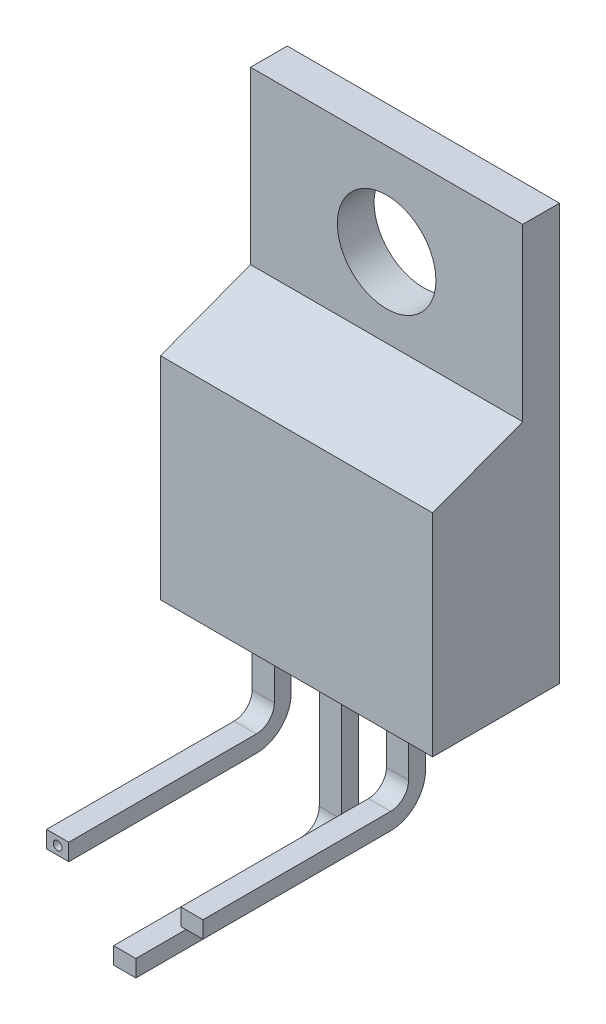
ISO-10303-21;
HEADER;
FILE_DESCRIPTION(('STEP AP214'),'2;1');
FILE_NAME('part.step','',(''),(''),'','','');
FILE_SCHEMA(('AUTOMOTIVE_DESIGN { 1 0 10303 214 1 1 1 1 }'));
ENDSEC;
DATA;
#1=APPLICATION_CONTEXT('core data for automotive mechanical design processes');
#2=APPLICATION_PROTOCOL_DEFINITION('international standard','automotive_design',2000,#1);
#3=PRODUCT_CONTEXT('',#1,'mechanical');
#4=PRODUCT('Part','Part','',(#3));
#5=PRODUCT_RELATED_PRODUCT_CATEGORY('part','',(#4));
#6=PRODUCT_DEFINITION_FORMATION('','',#4);
#7=PRODUCT_DEFINITION_CONTEXT('part definition',#1,'design');
#8=PRODUCT_DEFINITION('design','',#6,#7);
#9=PRODUCT_DEFINITION_SHAPE('','',#8);
#10=(LENGTH_UNIT() NAMED_UNIT(*) SI_UNIT(.MILLI.,.METRE.));
#11=(NAMED_UNIT(*) PLANE_ANGLE_UNIT() SI_UNIT($,.RADIAN.));
#12=(NAMED_UNIT(*) SI_UNIT($,.STERADIAN.) SOLID_ANGLE_UNIT());
#13=UNCERTAINTY_MEASURE_WITH_UNIT(LENGTH_MEASURE(1.E-05),#10,'distance_accuracy_value','');
#14=(GEOMETRIC_REPRESENTATION_CONTEXT(3) GLOBAL_UNCERTAINTY_ASSIGNED_CONTEXT((#13)) GLOBAL_UNIT_ASSIGNED_CONTEXT((#10,
#11,#12)) REPRESENTATION_CONTEXT('',''));
#15=CARTESIAN_POINT('',(0.,0.,0.));
#16=DIRECTION('',(0.,0.,1.));
#17=DIRECTION('',(1.,0.,0.));
#18=AXIS2_PLACEMENT_3D('',#15,#16,#17);
#19=CARTESIAN_POINT('',(-2.61,19.25,0.));
#20=DIRECTION('',(1.,0.,0.));
#21=DIRECTION('',(0.,0.,-1.));
#22=AXIS2_PLACEMENT_3D('',#19,#20,#21);
#23=PLANE('',#22);
#24=DIRECTION('',(0.,-0.351424300429918,0.936216300364047));
#25=VECTOR('',#24,1.);
#26=CARTESIAN_POINT('',(-2.61,12.78,-3.40999999999988));
#27=LINE('',#26,#25);
#28=CARTESIAN_POINT('',(-2.61,12.78,-3.40999999999988));
#29=VERTEX_POINT('',#28);
#30=CARTESIAN_POINT('',(-2.61,11.5,0.));
#31=VERTEX_POINT('',#30);
#32=EDGE_CURVE('E446',#29,#31,#27,.T.);
#33=ORIENTED_EDGE('',*,*,#32,.F.);
#34=DIRECTION('',(0.,-1.,0.));
#35=VECTOR('',#34,1.);
#36=CARTESIAN_POINT('',(-2.61,19.25,-3.40999999999988));
#37=LINE('',#36,#35);
#38=CARTESIAN_POINT('',(-2.61,19.25,-3.40999999999988));
#39=VERTEX_POINT('',#38);
#40=EDGE_CURVE('E444',#39,#29,#37,.T.);
#41=ORIENTED_EDGE('',*,*,#40,.F.);
#42=DIRECTION('',(0.,0.,1.));
#43=VECTOR('',#42,1.);
#44=CARTESIAN_POINT('',(-2.61,19.25,0.));
#45=LINE('',#44,#43);
#46=CARTESIAN_POINT('',(-2.61,19.25,-4.8));
#47=VERTEX_POINT('',#46);
#48=EDGE_CURVE('E455',#47,#39,#45,.T.);
#49=ORIENTED_EDGE('',*,*,#48,.F.);
#50=DIRECTION('',(0.,-1.,0.));
#51=VECTOR('',#50,1.);
#52=CARTESIAN_POINT('',(-2.61,19.25,-4.8));
#53=LINE('',#52,#51);
#54=CARTESIAN_POINT('',(-2.61,3.5,-4.8));
#55=VERTEX_POINT('',#54);
#56=EDGE_CURVE('E463',#47,#55,#53,.T.);
#57=ORIENTED_EDGE('',*,*,#56,.T.);
#58=DIRECTION('',(0.,0.,1.));
#59=VECTOR('',#58,1.);
#60=CARTESIAN_POINT('',(-2.61,3.5,0.));
#61=LINE('',#60,#59);
#62=CARTESIAN_POINT('',(-2.61,3.5,0.));
#63=VERTEX_POINT('',#62);
#64=EDGE_CURVE('E454',#55,#63,#61,.T.);
#65=ORIENTED_EDGE('',*,*,#64,.T.);
#66=DIRECTION('',(0.,-1.,0.));
#67=VECTOR('',#66,1.);
#68=CARTESIAN_POINT('',(-2.61,19.25,0.));
#69=LINE('',#68,#67);
#70=EDGE_CURVE('E479',#31,#63,#69,.T.);
#71=ORIENTED_EDGE('',*,*,#70,.F.);
#72=EDGE_LOOP('',(#33,#41,#49,#57,#65,#71));
#73=FACE_BOUND('',#72,.T.);
#74=ADVANCED_FACE('F32',(#73),#23,.F.);
#75=CARTESIAN_POINT('',(-2.61,19.25,0.));
#76=DIRECTION('',(0.,0.,-1.));
#77=DIRECTION('',(-1.,0.,0.));
#78=AXIS2_PLACEMENT_3D('',#75,#76,#77);
#79=PLANE('',#78);
#80=DIRECTION('',(0.,-1.,0.));
#81=VECTOR('',#80,1.);
#82=CARTESIAN_POINT('',(7.69,19.25,0.));
#83=LINE('',#82,#81);
#84=CARTESIAN_POINT('',(7.69,11.5,0.));
#85=VERTEX_POINT('',#84);
#86=CARTESIAN_POINT('',(7.69,3.5,0.));
#87=VERTEX_POINT('',#86);
#88=EDGE_CURVE('E477',#85,#87,#83,.T.);
#89=ORIENTED_EDGE('',*,*,#88,.F.);
#90=DIRECTION('',(1.,0.,0.));
#91=VECTOR('',#90,1.);
#92=CARTESIAN_POINT('',(-11.0770301759235,11.5,0.));
#93=LINE('',#92,#91);
#94=EDGE_CURVE('E443',#31,#85,#93,.T.);
#95=ORIENTED_EDGE('',*,*,#94,.F.);
#96=ORIENTED_EDGE('',*,*,#70,.T.);
#97=DIRECTION('',(1.,0.,0.));
#98=VECTOR('',#97,1.);
#99=CARTESIAN_POINT('',(-2.61,3.5,0.));
#100=LINE('',#99,#98);
#101=EDGE_CURVE('E466',#63,#87,#100,.T.);
#102=ORIENTED_EDGE('',*,*,#101,.T.);
#103=EDGE_LOOP('',(#89,#95,#96,#102));
#104=FACE_BOUND('',#103,.T.);
#105=ADVANCED_FACE('F514',(#104),#79,.F.);
#106=CARTESIAN_POINT('',(7.69,19.25,0.));
#107=DIRECTION('',(-1.,0.,0.));
#108=DIRECTION('',(0.,0.,1.));
#109=AXIS2_PLACEMENT_3D('',#106,#107,#108);
#110=PLANE('',#109);
#111=DIRECTION('',(0.,0.,-1.));
#112=VECTOR('',#111,1.);
#113=CARTESIAN_POINT('',(7.69,19.25,0.));
#114=LINE('',#113,#112);
#115=CARTESIAN_POINT('',(7.69,19.25,-3.40999999999988));
#116=VERTEX_POINT('',#115);
#117=CARTESIAN_POINT('',(7.69,19.25,-4.8));
#118=VERTEX_POINT('',#117);
#119=EDGE_CURVE('E458',#116,#118,#114,.T.);
#120=ORIENTED_EDGE('',*,*,#119,.F.);
#121=DIRECTION('',(0.,-1.,0.));
#122=VECTOR('',#121,1.);
#123=CARTESIAN_POINT('',(7.69,19.25,-3.40999999999988));
#124=LINE('',#123,#122);
#125=CARTESIAN_POINT('',(7.69,12.78,-3.40999999999988));
#126=VERTEX_POINT('',#125);
#127=EDGE_CURVE('E437',#116,#126,#124,.T.);
#128=ORIENTED_EDGE('',*,*,#127,.T.);
#129=DIRECTION('',(0.,-0.351424300429918,0.936216300364047));
#130=VECTOR('',#129,1.);
#131=CARTESIAN_POINT('',(7.69,12.78,-3.40999999999988));
#132=LINE('',#131,#130);
#133=EDGE_CURVE('E440',#126,#85,#132,.T.);
#134=ORIENTED_EDGE('',*,*,#133,.T.);
#135=ORIENTED_EDGE('',*,*,#88,.T.);
#136=DIRECTION('',(0.,0.,-1.));
#137=VECTOR('',#136,1.);
#138=CARTESIAN_POINT('',(7.69,3.5,0.));
#139=LINE('',#138,#137);
#140=CARTESIAN_POINT('',(7.69,3.5,-4.8));
#141=VERTEX_POINT('',#140);
#142=EDGE_CURVE('E469',#87,#141,#139,.T.);
#143=ORIENTED_EDGE('',*,*,#142,.T.);
#144=DIRECTION('',(0.,-1.,0.));
#145=VECTOR('',#144,1.);
#146=CARTESIAN_POINT('',(7.69,19.25,-4.8));
#147=LINE('',#146,#145);
#148=EDGE_CURVE('E474',#118,#141,#147,.T.);
#149=ORIENTED_EDGE('',*,*,#148,.F.);
#150=EDGE_LOOP('',(#120,#128,#134,#135,#143,#149));
#151=FACE_BOUND('',#150,.T.);
#152=ADVANCED_FACE('F519',(#151),#110,.F.);
#153=CARTESIAN_POINT('',(-2.61,19.25,-4.8));
#154=DIRECTION('',(0.,0.,1.));
#155=DIRECTION('',(1.,0.,0.));
#156=AXIS2_PLACEMENT_3D('',#153,#154,#155);
#157=PLANE('',#156);
#158=CARTESIAN_POINT('',(2.54,15.77,-4.8));
#159=DIRECTION('',(0.,0.,1.));
#160=DIRECTION('',(1.,0.,0.));
#161=AXIS2_PLACEMENT_3D('',#158,#159,#160);
#162=CIRCLE('',#161,1.865);
#163=CARTESIAN_POINT('',(4.405,15.77,-4.8));
#164=VERTEX_POINT('',#163);
#165=EDGE_CURVE('E433',#164,#164,#162,.F.);
#166=ORIENTED_EDGE('',*,*,#165,.F.);
#167=EDGE_LOOP('',(#166));
#168=FACE_BOUND('',#167,.T.);
#169=DIRECTION('',(-1.,0.,0.));
#170=VECTOR('',#169,1.);
#171=CARTESIAN_POINT('',(-2.61,3.5,-4.8));
#172=LINE('',#171,#170);
#173=EDGE_CURVE('E459',#141,#55,#172,.T.);
#174=ORIENTED_EDGE('',*,*,#173,.T.);
#175=ORIENTED_EDGE('',*,*,#56,.F.);
#176=DIRECTION('',(-1.,0.,0.));
#177=VECTOR('',#176,1.);
#178=CARTESIAN_POINT('',(-2.61,19.25,-4.8));
#179=LINE('',#178,#177);
#180=EDGE_CURVE('E461',#118,#47,#179,.T.);
#181=ORIENTED_EDGE('',*,*,#180,.F.);
#182=ORIENTED_EDGE('',*,*,#148,.T.);
#183=EDGE_LOOP('',(#174,#175,#181,#182));
#184=FACE_BOUND('',#183,.T.);
#185=ADVANCED_FACE('F546',(#168,#184),#157,.F.);
#186=CARTESIAN_POINT('',(-2.61,19.25,-4.8));
#187=DIRECTION('',(0.,-1.,0.));
#188=DIRECTION('',(0.,0.,-1.));
#189=AXIS2_PLACEMENT_3D('',#186,#187,#188);
#190=PLANE('',#189);
#191=ORIENTED_EDGE('',*,*,#48,.T.);
#192=DIRECTION('',(1.,0.,0.));
#193=VECTOR('',#192,1.);
#194=CARTESIAN_POINT('',(-11.0770301759235,19.25,-3.40999999999988));
#195=LINE('',#194,#193);
#196=EDGE_CURVE('E447',#39,#116,#195,.T.);
#197=ORIENTED_EDGE('',*,*,#196,.T.);
#198=ORIENTED_EDGE('',*,*,#119,.T.);
#199=ORIENTED_EDGE('',*,*,#180,.T.);
#200=EDGE_LOOP('',(#191,#197,#198,#199));
#201=FACE_BOUND('',#200,.T.);
#202=ADVANCED_FACE('F539',(#201),#190,.F.);
#203=CARTESIAN_POINT('',(-2.61,3.5,-4.8));
#204=DIRECTION('',(0.,-1.,0.));
#205=DIRECTION('',(0.,0.,-1.));
#206=AXIS2_PLACEMENT_3D('',#203,#204,#205);
#207=PLANE('',#206);
#208=DIRECTION('',(0.,0.,-1.));
#209=VECTOR('',#208,1.);
#210=CARTESIAN_POINT('',(2.12,3.5,-4.8));
#211=LINE('',#210,#209);
#212=CARTESIAN_POINT('',(2.12,3.5,-1.28));
#213=VERTEX_POINT('',#212);
#214=CARTESIAN_POINT('',(2.12,3.5,-1.92));
#215=VERTEX_POINT('',#214);
#216=EDGE_CURVE('E11',#213,#215,#211,.T.);
#217=ORIENTED_EDGE('',*,*,#216,.F.);
#218=DIRECTION('',(1.,0.,0.));
#219=VECTOR('',#218,1.);
#220=CARTESIAN_POINT('',(-2.61,3.5,-1.28));
#221=LINE('',#220,#219);
#222=CARTESIAN_POINT('',(2.96,3.5,-1.28));
#223=VERTEX_POINT('',#222);
#224=EDGE_CURVE('E39',#213,#223,#221,.T.);
#225=ORIENTED_EDGE('',*,*,#224,.T.);
#226=DIRECTION('',(0.,0.,1.));
#227=VECTOR('',#226,1.);
#228=CARTESIAN_POINT('',(2.96,3.5,-4.8));
#229=LINE('',#228,#227);
#230=CARTESIAN_POINT('',(2.96,3.5,-1.92));
#231=VERTEX_POINT('',#230);
#232=EDGE_CURVE('E481',#231,#223,#229,.T.);
#233=ORIENTED_EDGE('',*,*,#232,.F.);
#234=DIRECTION('',(-1.,0.,0.));
#235=VECTOR('',#234,1.);
#236=CARTESIAN_POINT('',(-2.61,3.5,-1.92));
#237=LINE('',#236,#235);
#238=EDGE_CURVE('E49',#231,#215,#237,.T.);
#239=ORIENTED_EDGE('',*,*,#238,.T.);
#240=EDGE_LOOP('',(#217,#225,#233,#239));
#241=FACE_BOUND('',#240,.T.);
#242=DIRECTION('',(0.,0.,1.));
#243=VECTOR('',#242,1.);
#244=CARTESIAN_POINT('',(5.49999999999999,3.5,-1.28));
#245=LINE('',#244,#243);
#246=CARTESIAN_POINT('',(5.49999999999999,3.5,-1.92));
#247=VERTEX_POINT('',#246);
#248=CARTESIAN_POINT('',(5.49999999999999,3.5,-1.28));
#249=VERTEX_POINT('',#248);
#250=EDGE_CURVE('E362',#247,#249,#245,.T.);
#251=ORIENTED_EDGE('',*,*,#250,.F.);
#252=DIRECTION('',(1.,0.,0.));
#253=VECTOR('',#252,1.);
#254=CARTESIAN_POINT('',(5.49999999999999,3.5,-1.92));
#255=LINE('',#254,#253);
#256=CARTESIAN_POINT('',(4.65999999999999,3.5,-1.92));
#257=VERTEX_POINT('',#256);
#258=EDGE_CURVE('E359',#257,#247,#255,.T.);
#259=ORIENTED_EDGE('',*,*,#258,.F.);
#260=DIRECTION('',(0.,0.,-1.));
#261=VECTOR('',#260,1.);
#262=CARTESIAN_POINT('',(4.65999999999999,3.5,-1.28));
#263=LINE('',#262,#261);
#264=CARTESIAN_POINT('',(4.65999999999999,3.5,-1.28));
#265=VERTEX_POINT('',#264);
#266=EDGE_CURVE('E356',#265,#257,#263,.T.);
#267=ORIENTED_EDGE('',*,*,#266,.F.);
#268=DIRECTION('',(-1.,0.,0.));
#269=VECTOR('',#268,1.);
#270=CARTESIAN_POINT('',(5.49999999999999,3.5,-1.28));
#271=LINE('',#270,#269);
#272=EDGE_CURVE('E353',#249,#265,#271,.T.);
#273=ORIENTED_EDGE('',*,*,#272,.F.);
#274=EDGE_LOOP('',(#251,#259,#267,#273));
#275=FACE_BOUND('',#274,.T.);
#276=DIRECTION('',(0.,0.,-1.));
#277=VECTOR('',#276,1.);
#278=CARTESIAN_POINT('',(-0.42,3.5,-1.28));
#279=LINE('',#278,#277);
#280=CARTESIAN_POINT('',(-0.42,3.5,-1.28));
#281=VERTEX_POINT('',#280);
#282=CARTESIAN_POINT('',(-0.42,3.5,-1.92));
#283=VERTEX_POINT('',#282);
#284=EDGE_CURVE('E409',#281,#283,#279,.T.);
#285=ORIENTED_EDGE('',*,*,#284,.F.);
#286=DIRECTION('',(-1.,0.,0.));
#287=VECTOR('',#286,1.);
#288=CARTESIAN_POINT('',(-0.42,3.5,-1.28));
#289=LINE('',#288,#287);
#290=CARTESIAN_POINT('',(0.42,3.5,-1.28));
#291=VERTEX_POINT('',#290);
#292=EDGE_CURVE('E418',#291,#281,#289,.T.);
#293=ORIENTED_EDGE('',*,*,#292,.F.);
#294=DIRECTION('',(0.,0.,1.));
#295=VECTOR('',#294,1.);
#296=CARTESIAN_POINT('',(0.42,3.5,-1.28));
#297=LINE('',#296,#295);
#298=CARTESIAN_POINT('',(0.42,3.5,-1.92));
#299=VERTEX_POINT('',#298);
#300=EDGE_CURVE('E415',#299,#291,#297,.T.);
#301=ORIENTED_EDGE('',*,*,#300,.F.);
#302=DIRECTION('',(1.,0.,0.));
#303=VECTOR('',#302,1.);
#304=CARTESIAN_POINT('',(-0.42,3.5,-1.92));
#305=LINE('',#304,#303);
#306=EDGE_CURVE('E412',#283,#299,#305,.T.);
#307=ORIENTED_EDGE('',*,*,#306,.F.);
#308=EDGE_LOOP('',(#285,#293,#301,#307));
#309=FACE_BOUND('',#308,.T.);
#310=ORIENTED_EDGE('',*,*,#64,.F.);
#311=ORIENTED_EDGE('',*,*,#173,.F.);
#312=ORIENTED_EDGE('',*,*,#142,.F.);
#313=ORIENTED_EDGE('',*,*,#101,.F.);
#314=EDGE_LOOP('',(#310,#311,#312,#313));
#315=FACE_BOUND('',#314,.T.);
#316=ADVANCED_FACE('F486',(#241,#275,#309,#315),#207,.T.);
#317=CARTESIAN_POINT('',(-11.0770301759235,19.25,-3.40999999999988));
#318=DIRECTION('',(0.,0.,-1.));
#319=DIRECTION('',(0.,1.,0.));
#320=AXIS2_PLACEMENT_3D('',#317,#318,#319);
#321=PLANE('',#320);
#322=CARTESIAN_POINT('',(2.54,15.77,-3.40999999999988));
#323=DIRECTION('',(0.,0.,-1.));
#324=DIRECTION('',(0.,1.,0.));
#325=AXIS2_PLACEMENT_3D('',#322,#323,#324);
#326=CIRCLE('',#325,1.865);
#327=CARTESIAN_POINT('',(2.54,17.635,-3.40999999999988));
#328=VERTEX_POINT('',#327);
#329=EDGE_CURVE('E436',#328,#328,#326,.T.);
#330=ORIENTED_EDGE('',*,*,#329,.T.);
#331=EDGE_LOOP('',(#330));
#332=FACE_BOUND('',#331,.T.);
#333=ORIENTED_EDGE('',*,*,#40,.T.);
#334=DIRECTION('',(1.,0.,0.));
#335=VECTOR('',#334,1.);
#336=CARTESIAN_POINT('',(-11.0770301759235,12.78,-3.40999999999988));
#337=LINE('',#336,#335);
#338=EDGE_CURVE('E450',#29,#126,#337,.T.);
#339=ORIENTED_EDGE('',*,*,#338,.T.);
#340=ORIENTED_EDGE('',*,*,#127,.F.);
#341=ORIENTED_EDGE('',*,*,#196,.F.);
#342=EDGE_LOOP('',(#333,#339,#340,#341));
#343=FACE_BOUND('',#342,.T.);
#344=ADVANCED_FACE('F537',(#332,#343),#321,.F.);
#345=CARTESIAN_POINT('',(-11.0770301759235,12.78,-3.40999999999988));
#346=DIRECTION('',(0.,-0.936216300364046,-0.351424300429918));
#347=DIRECTION('',(0.,0.351424300429918,-0.936216300364047));
#348=AXIS2_PLACEMENT_3D('',#345,#346,#347);
#349=PLANE('',#348);
#350=ORIENTED_EDGE('',*,*,#32,.T.);
#351=ORIENTED_EDGE('',*,*,#94,.T.);
#352=ORIENTED_EDGE('',*,*,#133,.F.);
#353=ORIENTED_EDGE('',*,*,#338,.F.);
#354=EDGE_LOOP('',(#350,#351,#352,#353));
#355=FACE_BOUND('',#354,.T.);
#356=ADVANCED_FACE('F528',(#355),#349,.F.);
#357=CARTESIAN_POINT('',(2.54,15.77,-10.0750165876516));
#358=DIRECTION('',(0.,0.,1.));
#359=DIRECTION('',(1.,0.,0.));
#360=AXIS2_PLACEMENT_3D('',#357,#358,#359);
#361=CYLINDRICAL_SURFACE('',#360,1.865);
#362=ORIENTED_EDGE('',*,*,#165,.T.);
#363=EDGE_LOOP('',(#362));
#364=FACE_BOUND('',#363,.T.);
#365=ORIENTED_EDGE('',*,*,#329,.F.);
#366=EDGE_LOOP('',(#365));
#367=FACE_BOUND('',#366,.T.);
#368=ADVANCED_FACE('F562',(#364,#367),#361,.F.);
#369=CARTESIAN_POINT('',(-0.42,1.,-1.28));
#370=DIRECTION('',(0.,0.,-1.));
#371=DIRECTION('',(-1.,0.,0.));
#372=AXIS2_PLACEMENT_3D('',#369,#370,#371);
#373=PLANE('',#372);
#374=DIRECTION('',(-1.,0.,0.));
#375=VECTOR('',#374,1.);
#376=CARTESIAN_POINT('',(-0.42,1.,-1.28));
#377=LINE('',#376,#375);
#378=CARTESIAN_POINT('',(0.42,1.,-1.28));
#379=VERTEX_POINT('',#378);
#380=CARTESIAN_POINT('',(-0.42,1.,-1.28));
#381=VERTEX_POINT('',#380);
#382=EDGE_CURVE('E394',#379,#381,#377,.T.);
#383=ORIENTED_EDGE('',*,*,#382,.F.);
#384=DIRECTION('',(0.,1.,0.));
#385=VECTOR('',#384,1.);
#386=CARTESIAN_POINT('',(0.42,1.,-1.28));
#387=LINE('',#386,#385);
#388=EDGE_CURVE('E427',#379,#291,#387,.T.);
#389=ORIENTED_EDGE('',*,*,#388,.T.);
#390=ORIENTED_EDGE('',*,*,#292,.T.);
#391=DIRECTION('',(0.,1.,0.));
#392=VECTOR('',#391,1.);
#393=CARTESIAN_POINT('',(-0.42,1.,-1.28));
#394=LINE('',#393,#392);
#395=EDGE_CURVE('E430',#381,#281,#394,.T.);
#396=ORIENTED_EDGE('',*,*,#395,.F.);
#397=EDGE_LOOP('',(#383,#389,#390,#396));
#398=FACE_BOUND('',#397,.T.);
#399=ADVANCED_FACE('F568',(#398),#373,.F.);
#400=CARTESIAN_POINT('',(-0.42,1.00000000000001,-1.92));
#401=DIRECTION('',(0.,0.,1.));
#402=DIRECTION('',(1.,0.,0.));
#403=AXIS2_PLACEMENT_3D('',#400,#401,#402);
#404=PLANE('',#403);
#405=DIRECTION('',(1.,0.,0.));
#406=VECTOR('',#405,1.);
#407=CARTESIAN_POINT('',(-0.42,1.00000000000001,-1.92));
#408=LINE('',#407,#406);
#409=CARTESIAN_POINT('',(-0.42,1.00000000000001,-1.92));
#410=VERTEX_POINT('',#409);
#411=CARTESIAN_POINT('',(0.42,1.00000000000001,-1.92));
#412=VERTEX_POINT('',#411);
#413=EDGE_CURVE('E386',#410,#412,#408,.T.);
#414=ORIENTED_EDGE('',*,*,#413,.F.);
#415=DIRECTION('',(0.,1.,0.));
#416=VECTOR('',#415,1.);
#417=CARTESIAN_POINT('',(-0.42,1.00000000000001,-1.92));
#418=LINE('',#417,#416);
#419=EDGE_CURVE('E421',#410,#283,#418,.T.);
#420=ORIENTED_EDGE('',*,*,#419,.T.);
#421=ORIENTED_EDGE('',*,*,#306,.T.);
#422=DIRECTION('',(0.,1.,0.));
#423=VECTOR('',#422,1.);
#424=CARTESIAN_POINT('',(0.42,1.00000000000001,-1.92));
#425=LINE('',#424,#423);
#426=EDGE_CURVE('E424',#412,#299,#425,.T.);
#427=ORIENTED_EDGE('',*,*,#426,.F.);
#428=EDGE_LOOP('',(#414,#420,#421,#427));
#429=FACE_BOUND('',#428,.T.);
#430=ADVANCED_FACE('F572',(#429),#404,.F.);
#431=CARTESIAN_POINT('',(0.,1.,-0.600000000000001));
#432=DIRECTION('',(1.,0.,0.));
#433=DIRECTION('',(0.,0.,-1.));
#434=AXIS2_PLACEMENT_3D('',#431,#432,#433);
#435=CYLINDRICAL_SURFACE('',#434,0.68);
#436=DIRECTION('',(-1.,0.,0.));
#437=VECTOR('',#436,1.);
#438=CARTESIAN_POINT('',(-0.42,0.32,-0.600000000000001));
#439=LINE('',#438,#437);
#440=CARTESIAN_POINT('',(0.42,0.32,-0.600000000000001));
#441=VERTEX_POINT('',#440);
#442=CARTESIAN_POINT('',(-0.42,0.32,-0.600000000000001));
#443=VERTEX_POINT('',#442);
#444=EDGE_CURVE('E380',#441,#443,#439,.T.);
#445=ORIENTED_EDGE('',*,*,#444,.F.);
#446=CARTESIAN_POINT('',(0.42,1.,-0.600000000000001));
#447=DIRECTION('',(1.,0.,0.));
#448=DIRECTION('',(0.,0.,-1.));
#449=AXIS2_PLACEMENT_3D('',#446,#447,#448);
#450=CIRCLE('',#449,0.68);
#451=EDGE_CURVE('E403',#441,#379,#450,.T.);
#452=ORIENTED_EDGE('',*,*,#451,.T.);
#453=ORIENTED_EDGE('',*,*,#382,.T.);
#454=CARTESIAN_POINT('',(-0.42,1.,-0.600000000000001));
#455=DIRECTION('',(1.,0.,0.));
#456=DIRECTION('',(0.,0.,-1.));
#457=AXIS2_PLACEMENT_3D('',#454,#455,#456);
#458=CIRCLE('',#457,0.68);
#459=EDGE_CURVE('E406',#443,#381,#458,.T.);
#460=ORIENTED_EDGE('',*,*,#459,.F.);
#461=EDGE_LOOP('',(#445,#452,#453,#460));
#462=FACE_BOUND('',#461,.T.);
#463=ADVANCED_FACE('F576',(#462),#435,.F.);
#464=CARTESIAN_POINT('',(0.,1.,-0.600000000000001));
#465=DIRECTION('',(1.,0.,0.));
#466=DIRECTION('',(0.,0.,-1.));
#467=AXIS2_PLACEMENT_3D('',#464,#465,#466);
#468=CYLINDRICAL_SURFACE('',#467,1.32);
#469=DIRECTION('',(1.,0.,0.));
#470=VECTOR('',#469,1.);
#471=CARTESIAN_POINT('',(-0.42,-0.32,-0.600000000000001));
#472=LINE('',#471,#470);
#473=CARTESIAN_POINT('',(-0.42,-0.32,-0.600000000000001));
#474=VERTEX_POINT('',#473);
#475=CARTESIAN_POINT('',(0.42,-0.32,-0.600000000000001));
#476=VERTEX_POINT('',#475);
#477=EDGE_CURVE('E377',#474,#476,#472,.T.);
#478=ORIENTED_EDGE('',*,*,#477,.F.);
#479=CARTESIAN_POINT('',(-0.42,1.,-0.600000000000001));
#480=DIRECTION('',(1.,0.,0.));
#481=DIRECTION('',(0.,0.,-1.));
#482=AXIS2_PLACEMENT_3D('',#479,#480,#481);
#483=CIRCLE('',#482,1.32);
#484=EDGE_CURVE('E397',#474,#410,#483,.T.);
#485=ORIENTED_EDGE('',*,*,#484,.T.);
#486=ORIENTED_EDGE('',*,*,#413,.T.);
#487=CARTESIAN_POINT('',(0.42,1.,-0.600000000000001));
#488=DIRECTION('',(1.,0.,0.));
#489=DIRECTION('',(0.,0.,-1.));
#490=AXIS2_PLACEMENT_3D('',#487,#488,#489);
#491=CIRCLE('',#490,1.32);
#492=EDGE_CURVE('E400',#476,#412,#491,.T.);
#493=ORIENTED_EDGE('',*,*,#492,.F.);
#494=EDGE_LOOP('',(#478,#485,#486,#493));
#495=FACE_BOUND('',#494,.T.);
#496=ADVANCED_FACE('F580',(#495),#468,.T.);
#497=CARTESIAN_POINT('',(-0.42,0.32,-0.600000000000001));
#498=DIRECTION('',(-1.,0.,0.));
#499=DIRECTION('',(0.,-1.,0.));
#500=AXIS2_PLACEMENT_3D('',#497,#498,#499);
#501=PLANE('',#500);
#502=DIRECTION('',(0.,0.,1.));
#503=VECTOR('',#502,1.);
#504=CARTESIAN_POINT('',(-0.42,-0.32,-0.600000000000001));
#505=LINE('',#504,#503);
#506=CARTESIAN_POINT('',(-0.42,-0.32,6.5));
#507=VERTEX_POINT('',#506);
#508=EDGE_CURVE('E383',#474,#507,#505,.T.);
#509=ORIENTED_EDGE('',*,*,#508,.T.);
#510=DIRECTION('',(0.,-1.,0.));
#511=VECTOR('',#510,1.);
#512=CARTESIAN_POINT('',(-0.42,0.32,6.5));
#513=LINE('',#512,#511);
#514=CARTESIAN_POINT('',(-0.42,0.32,6.5));
#515=VERTEX_POINT('',#514);
#516=EDGE_CURVE('E277',#515,#507,#513,.T.);
#517=ORIENTED_EDGE('',*,*,#516,.F.);
#518=DIRECTION('',(0.,0.,1.));
#519=VECTOR('',#518,1.);
#520=CARTESIAN_POINT('',(-0.42,0.32,-0.600000000000001));
#521=LINE('',#520,#519);
#522=EDGE_CURVE('E384',#443,#515,#521,.T.);
#523=ORIENTED_EDGE('',*,*,#522,.F.);
#524=ORIENTED_EDGE('',*,*,#459,.T.);
#525=ORIENTED_EDGE('',*,*,#395,.T.);
#526=ORIENTED_EDGE('',*,*,#284,.T.);
#527=ORIENTED_EDGE('',*,*,#419,.F.);
#528=ORIENTED_EDGE('',*,*,#484,.F.);
#529=EDGE_LOOP('',(#509,#517,#523,#524,#525,#526,#527,#528));
#530=FACE_BOUND('',#529,.T.);
#531=ADVANCED_FACE('F584',(#530),#501,.T.);
#532=CARTESIAN_POINT('',(-0.42,0.32,-0.600000000000001));
#533=DIRECTION('',(0.,1.,0.));
#534=DIRECTION('',(-1.,0.,0.));
#535=AXIS2_PLACEMENT_3D('',#532,#533,#534);
#536=PLANE('',#535);
#537=ORIENTED_EDGE('',*,*,#522,.T.);
#538=DIRECTION('',(-1.,0.,0.));
#539=VECTOR('',#538,1.);
#540=CARTESIAN_POINT('',(0.42,0.32,6.5));
#541=LINE('',#540,#539);
#542=CARTESIAN_POINT('',(0.42,0.32,6.5));
#543=VERTEX_POINT('',#542);
#544=EDGE_CURVE('E274',#543,#515,#541,.T.);
#545=ORIENTED_EDGE('',*,*,#544,.F.);
#546=DIRECTION('',(0.,0.,1.));
#547=VECTOR('',#546,1.);
#548=CARTESIAN_POINT('',(0.42,0.32,-0.600000000000001));
#549=LINE('',#548,#547);
#550=EDGE_CURVE('E387',#441,#543,#549,.T.);
#551=ORIENTED_EDGE('',*,*,#550,.F.);
#552=ORIENTED_EDGE('',*,*,#444,.T.);
#553=EDGE_LOOP('',(#537,#545,#551,#552));
#554=FACE_BOUND('',#553,.T.);
#555=ADVANCED_FACE('F588',(#554),#536,.T.);
#556=CARTESIAN_POINT('',(0.42,0.32,-0.600000000000001));
#557=DIRECTION('',(1.,0.,0.));
#558=DIRECTION('',(0.,0.,-1.));
#559=AXIS2_PLACEMENT_3D('',#556,#557,#558);
#560=PLANE('',#559);
#561=ORIENTED_EDGE('',*,*,#550,.T.);
#562=DIRECTION('',(0.,1.,0.));
#563=VECTOR('',#562,1.);
#564=CARTESIAN_POINT('',(0.42,-0.32,6.5));
#565=LINE('',#564,#563);
#566=CARTESIAN_POINT('',(0.42,-0.32,6.5));
#567=VERTEX_POINT('',#566);
#568=EDGE_CURVE('E283',#567,#543,#565,.T.);
#569=ORIENTED_EDGE('',*,*,#568,.F.);
#570=DIRECTION('',(0.,0.,1.));
#571=VECTOR('',#570,1.);
#572=CARTESIAN_POINT('',(0.42,-0.32,-0.600000000000001));
#573=LINE('',#572,#571);
#574=EDGE_CURVE('E389',#476,#567,#573,.T.);
#575=ORIENTED_EDGE('',*,*,#574,.F.);
#576=ORIENTED_EDGE('',*,*,#492,.T.);
#577=ORIENTED_EDGE('',*,*,#426,.T.);
#578=ORIENTED_EDGE('',*,*,#300,.T.);
#579=ORIENTED_EDGE('',*,*,#388,.F.);
#580=ORIENTED_EDGE('',*,*,#451,.F.);
#581=EDGE_LOOP('',(#561,#569,#575,#576,#577,#578,#579,#580));
#582=FACE_BOUND('',#581,.T.);
#583=ADVANCED_FACE('F594',(#582),#560,.T.);
#584=CARTESIAN_POINT('',(-0.42,-0.32,-0.600000000000001));
#585=DIRECTION('',(0.,-1.,0.));
#586=DIRECTION('',(1.,0.,0.));
#587=AXIS2_PLACEMENT_3D('',#584,#585,#586);
#588=PLANE('',#587);
#589=ORIENTED_EDGE('',*,*,#574,.T.);
#590=DIRECTION('',(1.,0.,0.));
#591=VECTOR('',#590,1.);
#592=CARTESIAN_POINT('',(-0.42,-0.32,6.5));
#593=LINE('',#592,#591);
#594=EDGE_CURVE('E280',#507,#567,#593,.T.);
#595=ORIENTED_EDGE('',*,*,#594,.F.);
#596=ORIENTED_EDGE('',*,*,#508,.F.);
#597=ORIENTED_EDGE('',*,*,#477,.T.);
#598=EDGE_LOOP('',(#589,#595,#596,#597));
#599=FACE_BOUND('',#598,.T.);
#600=ADVANCED_FACE('F590',(#599),#588,.T.);
#601=CARTESIAN_POINT('',(5.49999999999999,1.00000000000001,-1.92));
#602=DIRECTION('',(0.,0.,1.));
#603=DIRECTION('',(1.,0.,0.));
#604=AXIS2_PLACEMENT_3D('',#601,#602,#603);
#605=PLANE('',#604);
#606=DIRECTION('',(1.,0.,0.));
#607=VECTOR('',#606,1.);
#608=CARTESIAN_POINT('',(5.49999999999999,1.00000000000001,-1.92));
#609=LINE('',#608,#607);
#610=CARTESIAN_POINT('',(4.65999999999999,1.00000000000001,-1.92));
#611=VERTEX_POINT('',#610);
#612=CARTESIAN_POINT('',(5.49999999999999,1.00000000000001,-1.92));
#613=VERTEX_POINT('',#612);
#614=EDGE_CURVE('E338',#611,#613,#609,.T.);
#615=ORIENTED_EDGE('',*,*,#614,.F.);
#616=DIRECTION('',(0.,1.,0.));
#617=VECTOR('',#616,1.);
#618=CARTESIAN_POINT('',(4.65999999999999,1.00000000000001,-1.92));
#619=LINE('',#618,#617);
#620=EDGE_CURVE('E368',#611,#257,#619,.T.);
#621=ORIENTED_EDGE('',*,*,#620,.T.);
#622=ORIENTED_EDGE('',*,*,#258,.T.);
#623=DIRECTION('',(0.,1.,0.));
#624=VECTOR('',#623,1.);
#625=CARTESIAN_POINT('',(5.49999999999999,1.00000000000001,-1.92));
#626=LINE('',#625,#624);
#627=EDGE_CURVE('E371',#613,#247,#626,.T.);
#628=ORIENTED_EDGE('',*,*,#627,.F.);
#629=EDGE_LOOP('',(#615,#621,#622,#628));
#630=FACE_BOUND('',#629,.T.);
#631=ADVANCED_FACE('F593',(#630),#605,.F.);
#632=CARTESIAN_POINT('',(5.49999999999999,1.,-1.28));
#633=DIRECTION('',(0.,0.,-1.));
#634=DIRECTION('',(-1.,0.,0.));
#635=AXIS2_PLACEMENT_3D('',#632,#633,#634);
#636=PLANE('',#635);
#637=DIRECTION('',(-1.,0.,0.));
#638=VECTOR('',#637,1.);
#639=CARTESIAN_POINT('',(5.49999999999999,1.,-1.28));
#640=LINE('',#639,#638);
#641=CARTESIAN_POINT('',(5.49999999999999,1.,-1.28));
#642=VERTEX_POINT('',#641);
#643=CARTESIAN_POINT('',(4.65999999999999,1.,-1.28));
#644=VERTEX_POINT('',#643);
#645=EDGE_CURVE('E330',#642,#644,#640,.T.);
#646=ORIENTED_EDGE('',*,*,#645,.F.);
#647=DIRECTION('',(0.,1.,0.));
#648=VECTOR('',#647,1.);
#649=CARTESIAN_POINT('',(5.49999999999999,1.,-1.28));
#650=LINE('',#649,#648);
#651=EDGE_CURVE('E374',#642,#249,#650,.T.);
#652=ORIENTED_EDGE('',*,*,#651,.T.);
#653=ORIENTED_EDGE('',*,*,#272,.T.);
#654=DIRECTION('',(0.,1.,0.));
#655=VECTOR('',#654,1.);
#656=CARTESIAN_POINT('',(4.65999999999999,1.,-1.28));
#657=LINE('',#656,#655);
#658=EDGE_CURVE('E365',#644,#265,#657,.T.);
#659=ORIENTED_EDGE('',*,*,#658,.F.);
#660=EDGE_LOOP('',(#646,#652,#653,#659));
#661=FACE_BOUND('',#660,.T.);
#662=ADVANCED_FACE('F604',(#661),#636,.F.);
#663=CARTESIAN_POINT('',(0.,1.,-0.600000000000001));
#664=DIRECTION('',(1.,0.,0.));
#665=DIRECTION('',(0.,0.,-1.));
#666=AXIS2_PLACEMENT_3D('',#663,#664,#665);
#667=CYLINDRICAL_SURFACE('',#666,1.32);
#668=DIRECTION('',(1.,0.,0.));
#669=VECTOR('',#668,1.);
#670=CARTESIAN_POINT('',(5.49999999999999,-0.319999999999998,-0.600000000000001));
#671=LINE('',#670,#669);
#672=CARTESIAN_POINT('',(4.65999999999999,-0.319999999999998,-0.600000000000001));
#673=VERTEX_POINT('',#672);
#674=CARTESIAN_POINT('',(5.49999999999999,-0.319999999999998,-0.600000000000001));
#675=VERTEX_POINT('',#674);
#676=EDGE_CURVE('E324',#673,#675,#671,.T.);
#677=ORIENTED_EDGE('',*,*,#676,.F.);
#678=CARTESIAN_POINT('',(4.65999999999999,1.,-0.600000000000001));
#679=DIRECTION('',(1.,0.,0.));
#680=DIRECTION('',(0.,0.,-1.));
#681=AXIS2_PLACEMENT_3D('',#678,#679,#680);
#682=CIRCLE('',#681,1.32);
#683=EDGE_CURVE('E344',#673,#611,#682,.T.);
#684=ORIENTED_EDGE('',*,*,#683,.T.);
#685=ORIENTED_EDGE('',*,*,#614,.T.);
#686=CARTESIAN_POINT('',(5.49999999999999,1.,-0.600000000000001));
#687=DIRECTION('',(1.,0.,0.));
#688=DIRECTION('',(0.,0.,-1.));
#689=AXIS2_PLACEMENT_3D('',#686,#687,#688);
#690=CIRCLE('',#689,1.32);
#691=EDGE_CURVE('E347',#675,#613,#690,.T.);
#692=ORIENTED_EDGE('',*,*,#691,.F.);
#693=EDGE_LOOP('',(#677,#684,#685,#692));
#694=FACE_BOUND('',#693,.T.);
#695=ADVANCED_FACE('F608',(#694),#667,.T.);
#696=CARTESIAN_POINT('',(0.,1.,-0.600000000000001));
#697=DIRECTION('',(1.,0.,0.));
#698=DIRECTION('',(0.,0.,-1.));
#699=AXIS2_PLACEMENT_3D('',#696,#697,#698);
#700=CYLINDRICAL_SURFACE('',#699,0.679999999999999);
#701=DIRECTION('',(-1.,0.,0.));
#702=VECTOR('',#701,1.);
#703=CARTESIAN_POINT('',(5.49999999999999,0.320000000000001,-0.600000000000001));
#704=LINE('',#703,#702);
#705=CARTESIAN_POINT('',(5.49999999999999,0.320000000000001,-0.600000000000001));
#706=VERTEX_POINT('',#705);
#707=CARTESIAN_POINT('',(4.65999999999999,0.320000000000001,-0.600000000000001));
#708=VERTEX_POINT('',#707);
#709=EDGE_CURVE('E321',#706,#708,#704,.T.);
#710=ORIENTED_EDGE('',*,*,#709,.F.);
#711=CARTESIAN_POINT('',(5.49999999999999,1.,-0.600000000000001));
#712=DIRECTION('',(1.,0.,0.));
#713=DIRECTION('',(0.,0.,-1.));
#714=AXIS2_PLACEMENT_3D('',#711,#712,#713);
#715=CIRCLE('',#714,0.679999999999999);
#716=EDGE_CURVE('E350',#706,#642,#715,.T.);
#717=ORIENTED_EDGE('',*,*,#716,.T.);
#718=ORIENTED_EDGE('',*,*,#645,.T.);
#719=CARTESIAN_POINT('',(4.65999999999999,1.,-0.600000000000001));
#720=DIRECTION('',(1.,0.,0.));
#721=DIRECTION('',(0.,0.,-1.));
#722=AXIS2_PLACEMENT_3D('',#719,#720,#721);
#723=CIRCLE('',#722,0.679999999999999);
#724=EDGE_CURVE('E341',#708,#644,#723,.T.);
#725=ORIENTED_EDGE('',*,*,#724,.F.);
#726=EDGE_LOOP('',(#710,#717,#718,#725));
#727=FACE_BOUND('',#726,.T.);
#728=ADVANCED_FACE('F612',(#727),#700,.F.);
#729=CARTESIAN_POINT('',(5.49999999999999,0.320000000000001,-0.600000000000001));
#730=DIRECTION('',(0.,1.,0.));
#731=DIRECTION('',(-1.,0.,0.));
#732=AXIS2_PLACEMENT_3D('',#729,#730,#731);
#733=PLANE('',#732);
#734=DIRECTION('',(0.,0.,1.));
#735=VECTOR('',#734,1.);
#736=CARTESIAN_POINT('',(4.65999999999999,0.320000000000001,-0.600000000000001));
#737=LINE('',#736,#735);
#738=CARTESIAN_POINT('',(4.65999999999999,0.320000000000001,6.5));
#739=VERTEX_POINT('',#738);
#740=EDGE_CURVE('E327',#708,#739,#737,.T.);
#741=ORIENTED_EDGE('',*,*,#740,.T.);
#742=DIRECTION('',(-1.,0.,0.));
#743=VECTOR('',#742,1.);
#744=CARTESIAN_POINT('',(5.49999999999999,0.320000000000001,6.5));
#745=LINE('',#744,#743);
#746=CARTESIAN_POINT('',(5.49999999999999,0.320000000000001,6.5));
#747=VERTEX_POINT('',#746);
#748=EDGE_CURVE('E265',#747,#739,#745,.T.);
#749=ORIENTED_EDGE('',*,*,#748,.F.);
#750=DIRECTION('',(0.,0.,1.));
#751=VECTOR('',#750,1.);
#752=CARTESIAN_POINT('',(5.49999999999999,0.320000000000001,-0.600000000000001));
#753=LINE('',#752,#751);
#754=EDGE_CURVE('E328',#706,#747,#753,.T.);
#755=ORIENTED_EDGE('',*,*,#754,.F.);
#756=ORIENTED_EDGE('',*,*,#709,.T.);
#757=EDGE_LOOP('',(#741,#749,#755,#756));
#758=FACE_BOUND('',#757,.T.);
#759=ADVANCED_FACE('F616',(#758),#733,.T.);
#760=CARTESIAN_POINT('',(5.49999999999999,0.320000000000001,-0.600000000000001));
#761=DIRECTION('',(1.,0.,0.));
#762=DIRECTION('',(0.,0.,-1.));
#763=AXIS2_PLACEMENT_3D('',#760,#761,#762);
#764=PLANE('',#763);
#765=ORIENTED_EDGE('',*,*,#754,.T.);
#766=DIRECTION('',(0.,1.,0.));
#767=VECTOR('',#766,1.);
#768=CARTESIAN_POINT('',(5.49999999999999,-0.319999999999998,6.5));
#769=LINE('',#768,#767);
#770=CARTESIAN_POINT('',(5.49999999999999,-0.319999999999998,6.5));
#771=VERTEX_POINT('',#770);
#772=EDGE_CURVE('E262',#771,#747,#769,.T.);
#773=ORIENTED_EDGE('',*,*,#772,.F.);
#774=DIRECTION('',(0.,0.,1.));
#775=VECTOR('',#774,1.);
#776=CARTESIAN_POINT('',(5.49999999999999,-0.319999999999998,-0.600000000000001));
#777=LINE('',#776,#775);
#778=EDGE_CURVE('E331',#675,#771,#777,.T.);
#779=ORIENTED_EDGE('',*,*,#778,.F.);
#780=ORIENTED_EDGE('',*,*,#691,.T.);
#781=ORIENTED_EDGE('',*,*,#627,.T.);
#782=ORIENTED_EDGE('',*,*,#250,.T.);
#783=ORIENTED_EDGE('',*,*,#651,.F.);
#784=ORIENTED_EDGE('',*,*,#716,.F.);
#785=EDGE_LOOP('',(#765,#773,#779,#780,#781,#782,#783,#784));
#786=FACE_BOUND('',#785,.T.);
#787=ADVANCED_FACE('F620',(#786),#764,.T.);
#788=CARTESIAN_POINT('',(5.49999999999999,-0.319999999999998,-0.600000000000001));
#789=DIRECTION('',(0.,-1.,0.));
#790=DIRECTION('',(1.,0.,0.));
#791=AXIS2_PLACEMENT_3D('',#788,#789,#790);
#792=PLANE('',#791);
#793=ORIENTED_EDGE('',*,*,#778,.T.);
#794=DIRECTION('',(1.,0.,0.));
#795=VECTOR('',#794,1.);
#796=CARTESIAN_POINT('',(4.65999999999999,-0.319999999999998,6.5));
#797=LINE('',#796,#795);
#798=CARTESIAN_POINT('',(4.65999999999999,-0.319999999999998,6.5));
#799=VERTEX_POINT('',#798);
#800=EDGE_CURVE('E271',#799,#771,#797,.T.);
#801=ORIENTED_EDGE('',*,*,#800,.F.);
#802=DIRECTION('',(0.,0.,1.));
#803=VECTOR('',#802,1.);
#804=CARTESIAN_POINT('',(4.65999999999999,-0.319999999999998,-0.600000000000001));
#805=LINE('',#804,#803);
#806=EDGE_CURVE('E333',#673,#799,#805,.T.);
#807=ORIENTED_EDGE('',*,*,#806,.F.);
#808=ORIENTED_EDGE('',*,*,#676,.T.);
#809=EDGE_LOOP('',(#793,#801,#807,#808));
#810=FACE_BOUND('',#809,.T.);
#811=ADVANCED_FACE('F624',(#810),#792,.T.);
#812=CARTESIAN_POINT('',(4.65999999999999,0.320000000000001,-0.600000000000001));
#813=DIRECTION('',(-1.,0.,0.));
#814=DIRECTION('',(0.,0.,1.));
#815=AXIS2_PLACEMENT_3D('',#812,#813,#814);
#816=PLANE('',#815);
#817=ORIENTED_EDGE('',*,*,#806,.T.);
#818=DIRECTION('',(0.,-1.,0.));
#819=VECTOR('',#818,1.);
#820=CARTESIAN_POINT('',(4.65999999999999,0.320000000000001,6.5));
#821=LINE('',#820,#819);
#822=EDGE_CURVE('E268',#739,#799,#821,.T.);
#823=ORIENTED_EDGE('',*,*,#822,.F.);
#824=ORIENTED_EDGE('',*,*,#740,.F.);
#825=ORIENTED_EDGE('',*,*,#724,.T.);
#826=ORIENTED_EDGE('',*,*,#658,.T.);
#827=ORIENTED_EDGE('',*,*,#266,.T.);
#828=ORIENTED_EDGE('',*,*,#620,.F.);
#829=ORIENTED_EDGE('',*,*,#683,.F.);
#830=EDGE_LOOP('',(#817,#823,#824,#825,#826,#827,#828,#829));
#831=FACE_BOUND('',#830,.T.);
#832=ADVANCED_FACE('F511',(#831),#816,.T.);
#833=CARTESIAN_POINT('',(2.12,-1.54,-1.28));
#834=DIRECTION('',(0.,0.,-1.));
#835=DIRECTION('',(0.,1.,0.));
#836=AXIS2_PLACEMENT_3D('',#833,#834,#835);
#837=PLANE('',#836);
#838=ORIENTED_EDGE('',*,*,#224,.F.);
#839=DIRECTION('',(0.,1.,0.));
#840=VECTOR('',#839,1.);
#841=CARTESIAN_POINT('',(2.12,-1.54,-1.28));
#842=LINE('',#841,#840);
#843=CARTESIAN_POINT('',(2.12,-1.54,-1.28));
#844=VERTEX_POINT('',#843);
#845=EDGE_CURVE('E319',#844,#213,#842,.T.);
#846=ORIENTED_EDGE('',*,*,#845,.F.);
#847=DIRECTION('',(-1.,0.,0.));
#848=VECTOR('',#847,1.);
#849=CARTESIAN_POINT('',(2.12,-1.54,-1.28));
#850=LINE('',#849,#848);
#851=CARTESIAN_POINT('',(2.96,-1.54,-1.28));
#852=VERTEX_POINT('',#851);
#853=EDGE_CURVE('E296',#852,#844,#850,.T.);
#854=ORIENTED_EDGE('',*,*,#853,.F.);
#855=DIRECTION('',(0.,1.,0.));
#856=VECTOR('',#855,1.);
#857=CARTESIAN_POINT('',(2.96,-1.54,-1.28));
#858=LINE('',#857,#856);
#859=EDGE_CURVE('E316',#852,#223,#858,.T.);
#860=ORIENTED_EDGE('',*,*,#859,.T.);
#861=EDGE_LOOP('',(#838,#846,#854,#860));
#862=FACE_BOUND('',#861,.T.);
#863=ADVANCED_FACE('F492',(#862),#837,.F.);
#864=CARTESIAN_POINT('',(2.12,-1.54,-1.92));
#865=DIRECTION('',(0.,0.,1.));
#866=DIRECTION('',(0.,-1.,0.));
#867=AXIS2_PLACEMENT_3D('',#864,#865,#866);
#868=PLANE('',#867);
#869=ORIENTED_EDGE('',*,*,#238,.F.);
#870=DIRECTION('',(0.,1.,0.));
#871=VECTOR('',#870,1.);
#872=CARTESIAN_POINT('',(2.96,-1.54,-1.92));
#873=LINE('',#872,#871);
#874=CARTESIAN_POINT('',(2.96,-1.54,-1.92));
#875=VERTEX_POINT('',#874);
#876=EDGE_CURVE('E313',#875,#231,#873,.T.);
#877=ORIENTED_EDGE('',*,*,#876,.F.);
#878=DIRECTION('',(1.,0.,0.));
#879=VECTOR('',#878,1.);
#880=CARTESIAN_POINT('',(2.12,-1.54,-1.92));
#881=LINE('',#880,#879);
#882=CARTESIAN_POINT('',(2.12,-1.54,-1.92));
#883=VERTEX_POINT('',#882);
#884=EDGE_CURVE('E235',#883,#875,#881,.T.);
#885=ORIENTED_EDGE('',*,*,#884,.F.);
#886=DIRECTION('',(0.,1.,0.));
#887=VECTOR('',#886,1.);
#888=CARTESIAN_POINT('',(2.12,-1.54,-1.92));
#889=LINE('',#888,#887);
#890=EDGE_CURVE('E310',#883,#215,#889,.T.);
#891=ORIENTED_EDGE('',*,*,#890,.T.);
#892=EDGE_LOOP('',(#869,#877,#885,#891));
#893=FACE_BOUND('',#892,.T.);
#894=ADVANCED_FACE('F503',(#893),#868,.F.);
#895=CARTESIAN_POINT('',(0.,-1.54,-0.599999999999999));
#896=DIRECTION('',(1.,0.,0.));
#897=DIRECTION('',(0.,0.,-1.));
#898=AXIS2_PLACEMENT_3D('',#895,#896,#897);
#899=CYLINDRICAL_SURFACE('',#898,0.68);
#900=DIRECTION('',(-1.,0.,0.));
#901=VECTOR('',#900,1.);
#902=CARTESIAN_POINT('',(2.12,-2.22,-0.599999999999999));
#903=LINE('',#902,#901);
#904=CARTESIAN_POINT('',(2.96,-2.22,-0.599999999999999));
#905=VERTEX_POINT('',#904);
#906=CARTESIAN_POINT('',(2.12,-2.22,-0.599999999999999));
#907=VERTEX_POINT('',#906);
#908=EDGE_CURVE('E232',#905,#907,#903,.T.);
#909=ORIENTED_EDGE('',*,*,#908,.F.);
#910=CARTESIAN_POINT('',(2.96,-1.54,-0.599999999999999));
#911=DIRECTION('',(1.,0.,0.));
#912=DIRECTION('',(0.,0.,-1.));
#913=AXIS2_PLACEMENT_3D('',#910,#911,#912);
#914=CIRCLE('',#913,0.68);
#915=EDGE_CURVE('E305',#905,#852,#914,.T.);
#916=ORIENTED_EDGE('',*,*,#915,.T.);
#917=ORIENTED_EDGE('',*,*,#853,.T.);
#918=CARTESIAN_POINT('',(2.12,-1.54,-0.599999999999999));
#919=DIRECTION('',(1.,0.,0.));
#920=DIRECTION('',(0.,0.,-1.));
#921=AXIS2_PLACEMENT_3D('',#918,#919,#920);
#922=CIRCLE('',#921,0.68);
#923=EDGE_CURVE('E308',#907,#844,#922,.T.);
#924=ORIENTED_EDGE('',*,*,#923,.F.);
#925=EDGE_LOOP('',(#909,#916,#917,#924));
#926=FACE_BOUND('',#925,.T.);
#927=ADVANCED_FACE('F494',(#926),#899,.F.);
#928=CARTESIAN_POINT('',(0.,-1.54,-0.599999999999999));
#929=DIRECTION('',(1.,0.,0.));
#930=DIRECTION('',(0.,0.,-1.));
#931=AXIS2_PLACEMENT_3D('',#928,#929,#930);
#932=CYLINDRICAL_SURFACE('',#931,1.32);
#933=DIRECTION('',(1.,0.,0.));
#934=VECTOR('',#933,1.);
#935=CARTESIAN_POINT('',(2.12,-2.86,-0.599999999999999));
#936=LINE('',#935,#934);
#937=CARTESIAN_POINT('',(2.12,-2.86,-0.599999999999999));
#938=VERTEX_POINT('',#937);
#939=CARTESIAN_POINT('',(2.96,-2.86,-0.599999999999999));
#940=VERTEX_POINT('',#939);
#941=EDGE_CURVE('E286',#938,#940,#936,.T.);
#942=ORIENTED_EDGE('',*,*,#941,.F.);
#943=CARTESIAN_POINT('',(2.12,-1.54,-0.599999999999999));
#944=DIRECTION('',(1.,0.,0.));
#945=DIRECTION('',(0.,0.,-1.));
#946=AXIS2_PLACEMENT_3D('',#943,#944,#945);
#947=CIRCLE('',#946,1.32);
#948=EDGE_CURVE('E299',#938,#883,#947,.T.);
#949=ORIENTED_EDGE('',*,*,#948,.T.);
#950=ORIENTED_EDGE('',*,*,#884,.T.);
#951=CARTESIAN_POINT('',(2.96,-1.54,-0.599999999999999));
#952=DIRECTION('',(1.,0.,0.));
#953=DIRECTION('',(0.,0.,-1.));
#954=AXIS2_PLACEMENT_3D('',#951,#952,#953);
#955=CIRCLE('',#954,1.32);
#956=EDGE_CURVE('E302',#940,#875,#955,.T.);
#957=ORIENTED_EDGE('',*,*,#956,.F.);
#958=EDGE_LOOP('',(#942,#949,#950,#957));
#959=FACE_BOUND('',#958,.T.);
#960=ADVANCED_FACE('F500',(#959),#932,.T.);
#961=CARTESIAN_POINT('',(2.12,-2.22,-0.599999999999999));
#962=DIRECTION('',(-1.,0.,0.));
#963=DIRECTION('',(0.,0.,1.));
#964=AXIS2_PLACEMENT_3D('',#961,#962,#963);
#965=PLANE('',#964);
#966=ORIENTED_EDGE('',*,*,#845,.T.);
#967=ORIENTED_EDGE('',*,*,#216,.T.);
#968=ORIENTED_EDGE('',*,*,#890,.F.);
#969=ORIENTED_EDGE('',*,*,#948,.F.);
#970=DIRECTION('',(0.,0.,1.));
#971=VECTOR('',#970,1.);
#972=CARTESIAN_POINT('',(2.12,-2.86,-0.599999999999999));
#973=LINE('',#972,#971);
#974=CARTESIAN_POINT('',(2.12,-2.86,6.5));
#975=VERTEX_POINT('',#974);
#976=EDGE_CURVE('E243',#938,#975,#973,.T.);
#977=ORIENTED_EDGE('',*,*,#976,.T.);
#978=DIRECTION('',(0.,-1.,0.));
#979=VECTOR('',#978,1.);
#980=CARTESIAN_POINT('',(2.12,-2.22,6.5));
#981=LINE('',#980,#979);
#982=CARTESIAN_POINT('',(2.12,-2.22,6.5));
#983=VERTEX_POINT('',#982);
#984=EDGE_CURVE('E239',#983,#975,#981,.T.);
#985=ORIENTED_EDGE('',*,*,#984,.F.);
#986=DIRECTION('',(0.,0.,1.));
#987=VECTOR('',#986,1.);
#988=CARTESIAN_POINT('',(2.12,-2.22,-0.599999999999999));
#989=LINE('',#988,#987);
#990=EDGE_CURVE('E225',#907,#983,#989,.T.);
#991=ORIENTED_EDGE('',*,*,#990,.F.);
#992=ORIENTED_EDGE('',*,*,#923,.T.);
#993=EDGE_LOOP('',(#966,#967,#968,#969,#977,#985,#991,#992));
#994=FACE_BOUND('',#993,.T.);
#995=ADVANCED_FACE('F241',(#994),#965,.T.);
#996=CARTESIAN_POINT('',(2.12,-2.22,-0.599999999999999));
#997=DIRECTION('',(0.,1.,0.));
#998=DIRECTION('',(0.,0.,1.));
#999=AXIS2_PLACEMENT_3D('',#996,#997,#998);
#1000=PLANE('',#999);
#1001=ORIENTED_EDGE('',*,*,#990,.T.);
#1002=DIRECTION('',(-1.,0.,0.));
#1003=VECTOR('',#1002,1.);
#1004=CARTESIAN_POINT('',(2.96,-2.22,6.5));
#1005=LINE('',#1004,#1003);
#1006=CARTESIAN_POINT('',(2.96,-2.22,6.5));
#1007=VERTEX_POINT('',#1006);
#1008=EDGE_CURVE('E230',#1007,#983,#1005,.T.);
#1009=ORIENTED_EDGE('',*,*,#1008,.F.);
#1010=DIRECTION('',(0.,0.,1.));
#1011=VECTOR('',#1010,1.);
#1012=CARTESIAN_POINT('',(2.96,-2.22,-0.599999999999999));
#1013=LINE('',#1012,#1011);
#1014=EDGE_CURVE('E236',#905,#1007,#1013,.T.);
#1015=ORIENTED_EDGE('',*,*,#1014,.F.);
#1016=ORIENTED_EDGE('',*,*,#908,.T.);
#1017=EDGE_LOOP('',(#1001,#1009,#1015,#1016));
#1018=FACE_BOUND('',#1017,.T.);
#1019=ADVANCED_FACE('F227',(#1018),#1000,.T.);
#1020=CARTESIAN_POINT('',(2.96,-2.22,-0.599999999999999));
#1021=DIRECTION('',(1.,0.,0.));
#1022=DIRECTION('',(0.,0.,-1.));
#1023=AXIS2_PLACEMENT_3D('',#1020,#1021,#1022);
#1024=PLANE('',#1023);
#1025=ORIENTED_EDGE('',*,*,#876,.T.);
#1026=ORIENTED_EDGE('',*,*,#232,.T.);
#1027=ORIENTED_EDGE('',*,*,#859,.F.);
#1028=ORIENTED_EDGE('',*,*,#915,.F.);
#1029=ORIENTED_EDGE('',*,*,#1014,.T.);
#1030=DIRECTION('',(0.,1.,0.));
#1031=VECTOR('',#1030,1.);
#1032=CARTESIAN_POINT('',(2.96,-2.86,6.5));
#1033=LINE('',#1032,#1031);
#1034=CARTESIAN_POINT('',(2.96,-2.86,6.5));
#1035=VERTEX_POINT('',#1034);
#1036=EDGE_CURVE('E252',#1035,#1007,#1033,.T.);
#1037=ORIENTED_EDGE('',*,*,#1036,.F.);
#1038=DIRECTION('',(0.,0.,1.));
#1039=VECTOR('',#1038,1.);
#1040=CARTESIAN_POINT('',(2.96,-2.86,-0.599999999999999));
#1041=LINE('',#1040,#1039);
#1042=EDGE_CURVE('E291',#940,#1035,#1041,.T.);
#1043=ORIENTED_EDGE('',*,*,#1042,.F.);
#1044=ORIENTED_EDGE('',*,*,#956,.T.);
#1045=EDGE_LOOP('',(#1025,#1026,#1027,#1028,#1029,#1037,#1043,#1044));
#1046=FACE_BOUND('',#1045,.T.);
#1047=ADVANCED_FACE('F490',(#1046),#1024,.T.);
#1048=CARTESIAN_POINT('',(2.12,-2.86,-0.599999999999999));
#1049=DIRECTION('',(0.,-1.,0.));
#1050=DIRECTION('',(0.,0.,-1.));
#1051=AXIS2_PLACEMENT_3D('',#1048,#1049,#1050);
#1052=PLANE('',#1051);
#1053=ORIENTED_EDGE('',*,*,#1042,.T.);
#1054=DIRECTION('',(1.,0.,0.));
#1055=VECTOR('',#1054,1.);
#1056=CARTESIAN_POINT('',(2.12,-2.86,6.5));
#1057=LINE('',#1056,#1055);
#1058=EDGE_CURVE('E247',#975,#1035,#1057,.T.);
#1059=ORIENTED_EDGE('',*,*,#1058,.F.);
#1060=ORIENTED_EDGE('',*,*,#976,.F.);
#1061=ORIENTED_EDGE('',*,*,#941,.T.);
#1062=EDGE_LOOP('',(#1053,#1059,#1060,#1061));
#1063=FACE_BOUND('',#1062,.T.);
#1064=ADVANCED_FACE('F498',(#1063),#1052,.T.);
#1065=CARTESIAN_POINT('',(0.42,0.32,6.5));
#1066=DIRECTION('',(0.,0.,-1.));
#1067=DIRECTION('',(-1.,0.,0.));
#1068=AXIS2_PLACEMENT_3D('',#1065,#1066,#1067);
#1069=PLANE('',#1068);
#1070=CARTESIAN_POINT('',(0.,0.,6.5));
#1071=DIRECTION('',(0.,0.,1.));
#1072=DIRECTION('',(1.,0.,0.));
#1073=AXIS2_PLACEMENT_3D('',#1070,#1071,#1072);
#1074=CIRCLE('',#1073,0.165168519767762);
#1075=CARTESIAN_POINT('',(0.165168519767762,0.,6.5));
#1076=VERTEX_POINT('',#1075);
#1077=EDGE_CURVE('E256',#1076,#1076,#1074,.T.);
#1078=ORIENTED_EDGE('',*,*,#1077,.F.);
#1079=EDGE_LOOP('',(#1078));
#1080=FACE_BOUND('',#1079,.T.);
#1081=ORIENTED_EDGE('',*,*,#544,.T.);
#1082=ORIENTED_EDGE('',*,*,#516,.T.);
#1083=ORIENTED_EDGE('',*,*,#594,.T.);
#1084=ORIENTED_EDGE('',*,*,#568,.T.);
#1085=EDGE_LOOP('',(#1081,#1082,#1083,#1084));
#1086=FACE_BOUND('',#1085,.T.);
#1087=ADVANCED_FACE('F660',(#1080,#1086),#1069,.F.);
#1088=CARTESIAN_POINT('',(5.49999999999999,0.320000000000001,6.5));
#1089=DIRECTION('',(0.,0.,1.));
#1090=DIRECTION('',(1.,0.,0.));
#1091=AXIS2_PLACEMENT_3D('',#1088,#1089,#1090);
#1092=PLANE('',#1091);
#1093=ORIENTED_EDGE('',*,*,#772,.T.);
#1094=ORIENTED_EDGE('',*,*,#748,.T.);
#1095=ORIENTED_EDGE('',*,*,#822,.T.);
#1096=ORIENTED_EDGE('',*,*,#800,.T.);
#1097=EDGE_LOOP('',(#1093,#1094,#1095,#1096));
#1098=FACE_BOUND('',#1097,.T.);
#1099=ADVANCED_FACE('F641',(#1098),#1092,.T.);
#1100=CARTESIAN_POINT('',(2.12,-2.22,6.5));
#1101=DIRECTION('',(0.,0.,1.));
#1102=DIRECTION('',(1.,0.,0.));
#1103=AXIS2_PLACEMENT_3D('',#1100,#1101,#1102);
#1104=PLANE('',#1103);
#1105=ORIENTED_EDGE('',*,*,#1008,.T.);
#1106=ORIENTED_EDGE('',*,*,#984,.T.);
#1107=ORIENTED_EDGE('',*,*,#1058,.T.);
#1108=ORIENTED_EDGE('',*,*,#1036,.T.);
#1109=EDGE_LOOP('',(#1105,#1106,#1107,#1108));
#1110=FACE_BOUND('',#1109,.T.);
#1111=ADVANCED_FACE('F250',(#1110),#1104,.T.);
#1112=CARTESIAN_POINT('',(0.,0.,5.5));
#1113=DIRECTION('',(0.,0.,1.));
#1114=DIRECTION('',(1.,0.,0.));
#1115=AXIS2_PLACEMENT_3D('',#1112,#1113,#1114);
#1116=CYLINDRICAL_SURFACE('',#1115,0.165168519767762);
#1117=CARTESIAN_POINT('',(0.,0.,5.5));
#1118=DIRECTION('',(0.,0.,1.));
#1119=DIRECTION('',(1.,0.,0.));
#1120=AXIS2_PLACEMENT_3D('',#1117,#1118,#1119);
#1121=CIRCLE('',#1120,0.165168519767762);
#1122=CARTESIAN_POINT('',(0.165168519767762,0.,5.5));
#1123=VERTEX_POINT('',#1122);
#1124=EDGE_CURVE('E253',#1123,#1123,#1121,.T.);
#1125=ORIENTED_EDGE('',*,*,#1124,.F.);
#1126=EDGE_LOOP('',(#1125));
#1127=FACE_BOUND('',#1126,.T.);
#1128=ORIENTED_EDGE('',*,*,#1077,.T.);
#1129=EDGE_LOOP('',(#1128));
#1130=FACE_BOUND('',#1129,.T.);
#1131=ADVANCED_FACE('F719',(#1127,#1130),#1116,.F.);
#1132=CARTESIAN_POINT('',(0.,0.,5.5));
#1133=DIRECTION('',(0.,0.,1.));
#1134=DIRECTION('',(1.,0.,0.));
#1135=AXIS2_PLACEMENT_3D('',#1132,#1133,#1134);
#1136=PLANE('',#1135);
#1137=ORIENTED_EDGE('',*,*,#1124,.T.);
#1138=EDGE_LOOP('',(#1137));
#1139=FACE_BOUND('',#1138,.T.);
#1140=ADVANCED_FACE('F731',(#1139),#1136,.T.);
#1141=CLOSED_SHELL('',(#74,#105,#152,#185,#202,#316,#344,#356,#368,#399,#430,#463,#496,#531,
#555,#583,#600,#631,#662,#695,#728,#759,#787,#811,#832,#863,#894,#927,#960,#995,#1019,#1047,
#1064,#1087,#1099,#1111,#1131,#1140));
#1142=MANIFOLD_SOLID_BREP('B2',#1141);
#1143=ADVANCED_BREP_SHAPE_REPRESENTATION('',(#18,#1142),#14);
#1144=SHAPE_DEFINITION_REPRESENTATION(#9,#1143);
ENDSEC;
END-ISO-10303-21;
